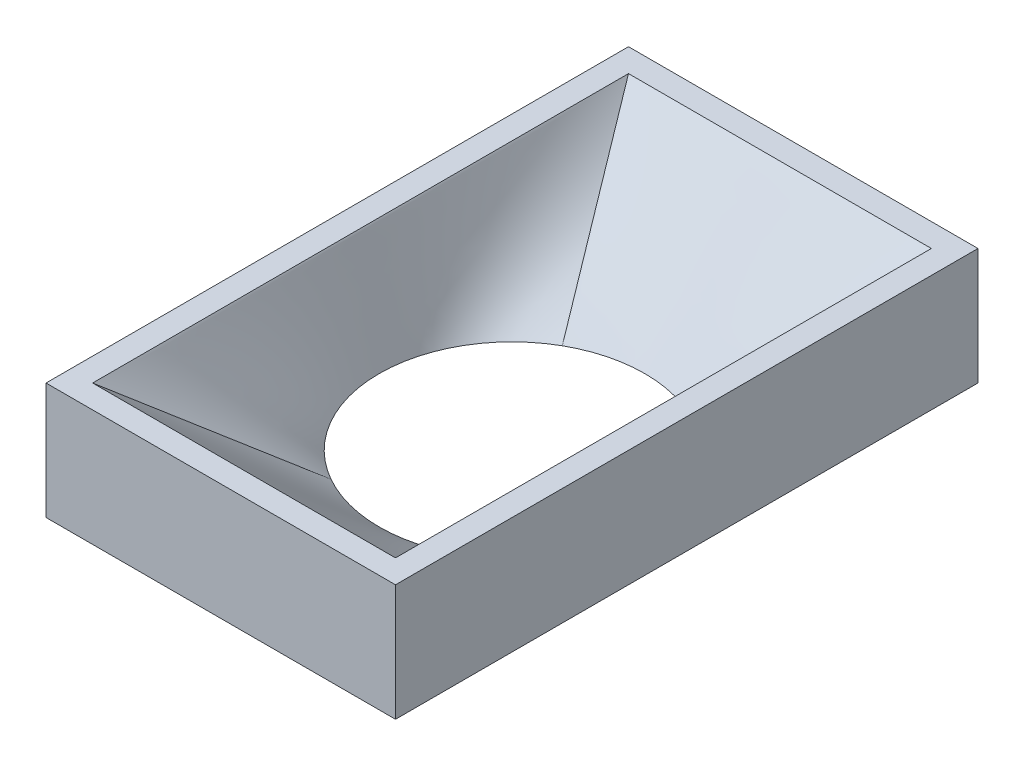
ISO-10303-21;
HEADER;
FILE_DESCRIPTION(('STEP AP214'),'2;1');
FILE_NAME('part.step','',(''),(''),'','','');
FILE_SCHEMA(('AUTOMOTIVE_DESIGN { 1 0 10303 214 1 1 1 1 }'));
ENDSEC;
DATA;
#1=APPLICATION_CONTEXT('core data for automotive mechanical design processes');
#2=APPLICATION_PROTOCOL_DEFINITION('international standard','automotive_design',2000,#1);
#3=PRODUCT_CONTEXT('',#1,'mechanical');
#4=PRODUCT('Part','Part','',(#3));
#5=PRODUCT_RELATED_PRODUCT_CATEGORY('part','',(#4));
#6=PRODUCT_DEFINITION_FORMATION('','',#4);
#7=PRODUCT_DEFINITION_CONTEXT('part definition',#1,'design');
#8=PRODUCT_DEFINITION('design','',#6,#7);
#9=PRODUCT_DEFINITION_SHAPE('','',#8);
#10=(LENGTH_UNIT() NAMED_UNIT(*) SI_UNIT(.MILLI.,.METRE.));
#11=(NAMED_UNIT(*) PLANE_ANGLE_UNIT() SI_UNIT($,.RADIAN.));
#12=(NAMED_UNIT(*) SI_UNIT($,.STERADIAN.) SOLID_ANGLE_UNIT());
#13=UNCERTAINTY_MEASURE_WITH_UNIT(LENGTH_MEASURE(1.E-05),#10,'distance_accuracy_value','');
#14=(GEOMETRIC_REPRESENTATION_CONTEXT(3) GLOBAL_UNCERTAINTY_ASSIGNED_CONTEXT((#13)) GLOBAL_UNIT_ASSIGNED_CONTEXT((#10,
#11,#12)) REPRESENTATION_CONTEXT('',''));
#15=CARTESIAN_POINT('',(0.,0.,0.));
#16=DIRECTION('',(0.,0.,1.));
#17=DIRECTION('',(1.,0.,0.));
#18=AXIS2_PLACEMENT_3D('',#15,#16,#17);
#19=CARTESIAN_POINT('',(19.05,12.7,-31.75));
#20=DIRECTION('',(-1.,0.,0.));
#21=DIRECTION('',(0.,0.,1.));
#22=AXIS2_PLACEMENT_3D('',#19,#20,#21);
#23=PLANE('',#22);
#24=DIRECTION('',(0.,0.,-1.));
#25=VECTOR('',#24,1.);
#26=CARTESIAN_POINT('',(19.05,0.,-31.75));
#27=LINE('',#26,#25);
#28=CARTESIAN_POINT('',(19.05,0.,31.75));
#29=VERTEX_POINT('',#28);
#30=CARTESIAN_POINT('',(19.05,0.,-31.75));
#31=VERTEX_POINT('',#30);
#32=EDGE_CURVE('E284',#29,#31,#27,.T.);
#33=ORIENTED_EDGE('',*,*,#32,.T.);
#34=DIRECTION('',(0.,-1.,0.));
#35=VECTOR('',#34,1.);
#36=CARTESIAN_POINT('',(19.05,12.7,-31.75));
#37=LINE('',#36,#35);
#38=CARTESIAN_POINT('',(19.05,12.7,-31.75));
#39=VERTEX_POINT('',#38);
#40=EDGE_CURVE('E12',#39,#31,#37,.T.);
#41=ORIENTED_EDGE('',*,*,#40,.F.);
#42=DIRECTION('',(0.,0.,-1.));
#43=VECTOR('',#42,1.);
#44=CARTESIAN_POINT('',(19.05,12.7,-31.75));
#45=LINE('',#44,#43);
#46=CARTESIAN_POINT('',(19.05,12.7,31.75));
#47=VERTEX_POINT('',#46);
#48=EDGE_CURVE('E269',#47,#39,#45,.T.);
#49=ORIENTED_EDGE('',*,*,#48,.F.);
#50=DIRECTION('',(0.,-1.,0.));
#51=VECTOR('',#50,1.);
#52=CARTESIAN_POINT('',(19.05,12.7,31.75));
#53=LINE('',#52,#51);
#54=EDGE_CURVE('E283',#47,#29,#53,.T.);
#55=ORIENTED_EDGE('',*,*,#54,.T.);
#56=EDGE_LOOP('',(#33,#41,#49,#55));
#57=FACE_BOUND('',#56,.T.);
#58=ADVANCED_FACE('F73',(#57),#23,.F.);
#59=CARTESIAN_POINT('',(-19.05,12.7,-31.75));
#60=DIRECTION('',(0.,0.,1.));
#61=DIRECTION('',(1.,0.,0.));
#62=AXIS2_PLACEMENT_3D('',#59,#60,#61);
#63=PLANE('',#62);
#64=DIRECTION('',(-1.,0.,0.));
#65=VECTOR('',#64,1.);
#66=CARTESIAN_POINT('',(-19.05,0.,-31.75));
#67=LINE('',#66,#65);
#68=CARTESIAN_POINT('',(-19.05,0.,-31.75));
#69=VERTEX_POINT('',#68);
#70=EDGE_CURVE('E288',#31,#69,#67,.T.);
#71=ORIENTED_EDGE('',*,*,#70,.T.);
#72=DIRECTION('',(0.,-1.,0.));
#73=VECTOR('',#72,1.);
#74=CARTESIAN_POINT('',(-19.05,12.7,-31.75));
#75=LINE('',#74,#73);
#76=CARTESIAN_POINT('',(-19.05,12.7,-31.75));
#77=VERTEX_POINT('',#76);
#78=EDGE_CURVE('E83',#77,#69,#75,.T.);
#79=ORIENTED_EDGE('',*,*,#78,.F.);
#80=DIRECTION('',(-1.,0.,0.));
#81=VECTOR('',#80,1.);
#82=CARTESIAN_POINT('',(-19.05,12.7,-31.75));
#83=LINE('',#82,#81);
#84=EDGE_CURVE('E273',#39,#77,#83,.T.);
#85=ORIENTED_EDGE('',*,*,#84,.F.);
#86=ORIENTED_EDGE('',*,*,#40,.T.);
#87=EDGE_LOOP('',(#71,#79,#85,#86));
#88=FACE_BOUND('',#87,.T.);
#89=ADVANCED_FACE('F321',(#88),#63,.F.);
#90=CARTESIAN_POINT('',(-19.05,12.7,-31.75));
#91=DIRECTION('',(1.,0.,0.));
#92=DIRECTION('',(0.,0.,-1.));
#93=AXIS2_PLACEMENT_3D('',#90,#91,#92);
#94=PLANE('',#93);
#95=DIRECTION('',(0.,0.,1.));
#96=VECTOR('',#95,1.);
#97=CARTESIAN_POINT('',(-19.05,0.,-31.75));
#98=LINE('',#97,#96);
#99=CARTESIAN_POINT('',(-19.05,0.,31.75));
#100=VERTEX_POINT('',#99);
#101=EDGE_CURVE('E291',#69,#100,#98,.T.);
#102=ORIENTED_EDGE('',*,*,#101,.T.);
#103=DIRECTION('',(0.,-1.,0.));
#104=VECTOR('',#103,1.);
#105=CARTESIAN_POINT('',(-19.05,12.7,31.75));
#106=LINE('',#105,#104);
#107=CARTESIAN_POINT('',(-19.05,12.7,31.75));
#108=VERTEX_POINT('',#107);
#109=EDGE_CURVE('E299',#108,#100,#106,.T.);
#110=ORIENTED_EDGE('',*,*,#109,.F.);
#111=DIRECTION('',(0.,0.,1.));
#112=VECTOR('',#111,1.);
#113=CARTESIAN_POINT('',(-19.05,12.7,-31.75));
#114=LINE('',#113,#112);
#115=EDGE_CURVE('E277',#77,#108,#114,.T.);
#116=ORIENTED_EDGE('',*,*,#115,.F.);
#117=ORIENTED_EDGE('',*,*,#78,.T.);
#118=EDGE_LOOP('',(#102,#110,#116,#117));
#119=FACE_BOUND('',#118,.T.);
#120=ADVANCED_FACE('F309',(#119),#94,.F.);
#121=CARTESIAN_POINT('',(-19.05,12.7,31.75));
#122=DIRECTION('',(0.,0.,-1.));
#123=DIRECTION('',(-1.,0.,0.));
#124=AXIS2_PLACEMENT_3D('',#121,#122,#123);
#125=PLANE('',#124);
#126=DIRECTION('',(1.,0.,0.));
#127=VECTOR('',#126,1.);
#128=CARTESIAN_POINT('',(-19.05,0.,31.75));
#129=LINE('',#128,#127);
#130=EDGE_CURVE('E274',#100,#29,#129,.T.);
#131=ORIENTED_EDGE('',*,*,#130,.T.);
#132=ORIENTED_EDGE('',*,*,#54,.F.);
#133=DIRECTION('',(1.,0.,0.));
#134=VECTOR('',#133,1.);
#135=CARTESIAN_POINT('',(-19.05,12.7,31.75));
#136=LINE('',#135,#134);
#137=EDGE_CURVE('E280',#108,#47,#136,.T.);
#138=ORIENTED_EDGE('',*,*,#137,.F.);
#139=ORIENTED_EDGE('',*,*,#109,.T.);
#140=EDGE_LOOP('',(#131,#132,#138,#139));
#141=FACE_BOUND('',#140,.T.);
#142=ADVANCED_FACE('F193',(#141),#125,.F.);
#143=CARTESIAN_POINT('',(0.,12.7,0.));
#144=DIRECTION('',(0.,1.,0.));
#145=DIRECTION('',(0.,0.,1.));
#146=AXIS2_PLACEMENT_3D('',#143,#144,#145);
#147=PLANE('',#146);
#148=DIRECTION('',(0.,0.,-1.));
#149=VECTOR('',#148,1.);
#150=CARTESIAN_POINT('',(16.51,12.7,29.21));
#151=LINE('',#150,#149);
#152=CARTESIAN_POINT('',(16.51,12.7,29.21));
#153=VERTEX_POINT('',#152);
#154=CARTESIAN_POINT('',(16.51,12.7,-29.21));
#155=VERTEX_POINT('',#154);
#156=EDGE_CURVE('E76',#153,#155,#151,.T.);
#157=ORIENTED_EDGE('',*,*,#156,.F.);
#158=DIRECTION('',(1.,0.,0.));
#159=VECTOR('',#158,1.);
#160=CARTESIAN_POINT('',(-16.51,12.7,29.21));
#161=LINE('',#160,#159);
#162=CARTESIAN_POINT('',(-16.51,12.7,29.21));
#163=VERTEX_POINT('',#162);
#164=EDGE_CURVE('E224',#163,#153,#161,.T.);
#165=ORIENTED_EDGE('',*,*,#164,.F.);
#166=DIRECTION('',(0.,0.,1.));
#167=VECTOR('',#166,1.);
#168=CARTESIAN_POINT('',(-16.51,12.7,-29.21));
#169=LINE('',#168,#167);
#170=CARTESIAN_POINT('',(-16.51,12.7,-29.21));
#171=VERTEX_POINT('',#170);
#172=EDGE_CURVE('E212',#171,#163,#169,.T.);
#173=ORIENTED_EDGE('',*,*,#172,.F.);
#174=DIRECTION('',(-1.,0.,0.));
#175=VECTOR('',#174,1.);
#176=CARTESIAN_POINT('',(16.51,12.7,-29.21));
#177=LINE('',#176,#175);
#178=EDGE_CURVE('E144',#155,#171,#177,.T.);
#179=ORIENTED_EDGE('',*,*,#178,.F.);
#180=EDGE_LOOP('',(#157,#165,#173,#179));
#181=FACE_BOUND('',#180,.T.);
#182=ORIENTED_EDGE('',*,*,#48,.T.);
#183=ORIENTED_EDGE('',*,*,#84,.T.);
#184=ORIENTED_EDGE('',*,*,#115,.T.);
#185=ORIENTED_EDGE('',*,*,#137,.T.);
#186=EDGE_LOOP('',(#182,#183,#184,#185));
#187=FACE_BOUND('',#186,.T.);
#188=ADVANCED_FACE('F190',(#181,#187),#147,.T.);
#189=CARTESIAN_POINT('',(0.,0.,0.));
#190=DIRECTION('',(0.,1.,0.));
#191=DIRECTION('',(0.,0.,1.));
#192=AXIS2_PLACEMENT_3D('',#189,#190,#191);
#193=PLANE('',#192);
#194=CARTESIAN_POINT('',(0.,0.,0.));
#195=DIRECTION('',(0.,-1.,0.));
#196=DIRECTION('',(0.,0.,-1.));
#197=AXIS2_PLACEMENT_3D('',#194,#195,#196);
#198=CIRCLE('',#197,14.478);
#199=CARTESIAN_POINT('',(7.12400496203789,0.,12.6040087789901));
#200=VERTEX_POINT('',#199);
#201=CARTESIAN_POINT('',(-7.12400496203788,0.,12.6040087789901));
#202=VERTEX_POINT('',#201);
#203=EDGE_CURVE('E158',#200,#202,#198,.T.);
#204=ORIENTED_EDGE('',*,*,#203,.F.);
#205=CARTESIAN_POINT('',(7.12400496203788,0.,-12.6040087789901));
#206=VERTEX_POINT('',#205);
#207=EDGE_CURVE('E166',#206,#200,#198,.T.);
#208=ORIENTED_EDGE('',*,*,#207,.F.);
#209=CARTESIAN_POINT('',(-7.12400496203789,0.,-12.6040087789901));
#210=VERTEX_POINT('',#209);
#211=EDGE_CURVE('E140',#210,#206,#198,.T.);
#212=ORIENTED_EDGE('',*,*,#211,.F.);
#213=EDGE_CURVE('E151',#202,#210,#198,.T.);
#214=ORIENTED_EDGE('',*,*,#213,.F.);
#215=EDGE_LOOP('',(#204,#208,#212,#214));
#216=FACE_BOUND('',#215,.T.);
#217=ORIENTED_EDGE('',*,*,#32,.F.);
#218=ORIENTED_EDGE('',*,*,#130,.F.);
#219=ORIENTED_EDGE('',*,*,#101,.F.);
#220=ORIENTED_EDGE('',*,*,#70,.F.);
#221=EDGE_LOOP('',(#217,#218,#219,#220));
#222=FACE_BOUND('',#221,.T.);
#223=ADVANCED_FACE('F164',(#216,#222),#193,.F.);
#224=CARTESIAN_POINT('',(7.12400496203789,0.,12.6040087789901));
#225=CARTESIAN_POINT('',(16.51,12.7,29.21));
#226=CARTESIAN_POINT('',(8.03838676719548,0.,12.0871842804228));
#227=CARTESIAN_POINT('',(16.51,12.7,26.7758333333333));
#228=CARTESIAN_POINT('',(8.95634185612382,0.,11.4364622338791));
#229=CARTESIAN_POINT('',(16.51,12.7,24.3416666666667));
#230=CARTESIAN_POINT('',(10.6922438918038,0.,9.83283521823099));
#231=CARTESIAN_POINT('',(16.51,12.7,19.4733333333333));
#232=CARTESIAN_POINT('',(11.5092515371836,0.,8.87879806344041));
#233=CARTESIAN_POINT('',(16.51,12.7,17.0391666666667));
#234=CARTESIAN_POINT('',(12.9045619371135,0.,6.69090481240889));
#235=CARTESIAN_POINT('',(16.51,12.7,12.1708333333334));
#236=CARTESIAN_POINT('',(13.4809458760483,0.,5.45683370481204));
#237=CARTESIAN_POINT('',(16.51,12.7,9.73666666666669));
#238=CARTESIAN_POINT('',(14.2685346845504,0.,2.81457878743855));
#239=CARTESIAN_POINT('',(16.51,12.7,4.86833333333336));
#240=CARTESIAN_POINT('',(14.478,0.,1.407900481328));
#241=CARTESIAN_POINT('',(16.51,12.7,2.43416666666669));
#242=CARTESIAN_POINT('',(14.478,0.,-1.40790048132801));
#243=CARTESIAN_POINT('',(16.51,12.7,-2.43416666666664));
#244=CARTESIAN_POINT('',(14.2685346845504,0.,-2.81457878743855));
#245=CARTESIAN_POINT('',(16.51,12.7,-4.86833333333331));
#246=CARTESIAN_POINT('',(13.4809458760483,0.,-5.45683370481204));
#247=CARTESIAN_POINT('',(16.51,12.7,-9.73666666666664));
#248=CARTESIAN_POINT('',(12.9045619371135,0.,-6.6909048124089));
#249=CARTESIAN_POINT('',(16.51,12.7,-12.1708333333333));
#250=CARTESIAN_POINT('',(11.5092515371836,0.,-8.87879806344042));
#251=CARTESIAN_POINT('',(16.51,12.7,-17.0391666666666));
#252=CARTESIAN_POINT('',(10.6922438918038,0.,-9.832835218231));
#253=CARTESIAN_POINT('',(16.51,12.7,-19.4733333333333));
#254=CARTESIAN_POINT('',(8.95634185612381,0.,-11.4364622338791));
#255=CARTESIAN_POINT('',(16.51,12.7,-24.3416666666667));
#256=CARTESIAN_POINT('',(8.03838676719548,0.,-12.0871842804228));
#257=CARTESIAN_POINT('',(16.51,12.7,-26.7758333333333));
#258=CARTESIAN_POINT('',(7.12400496203788,0.,-12.6040087789901));
#259=CARTESIAN_POINT('',(16.51,12.7,-29.21));
#260=B_SPLINE_SURFACE_WITH_KNOTS('',3,1,((#224,#225),(#226,#227),(#228,#229),(#230,#231),(#232,
#233),(#234,#235),(#236,#237),(#238,#239),(#240,#241),(#242,#243),(#244,#245),(#246,#247),(#248,
#249),(#250,#251),(#252,#253),(#254,#255),(#256,#257),(#258,#259)),.UNSPECIFIED.,.F.,.F.,.F.,(4,
2,2,2,2,2,2,2,4),(2,2),(0.,0.125,0.25,0.375,0.5,0.625,0.75,0.875,1.),(0.,1.),.UNSPECIFIED.);
#261=DIRECTION('',(-0.409581519176259,-0.554196467449643,-0.724644226234919));
#262=VECTOR('',#261,1.);
#263=CARTESIAN_POINT('',(11.8170024810189,6.35,20.907004389495));
#264=LINE('',#263,#262);
#265=EDGE_CURVE('E169',#153,#200,#264,.T.);
#266=DIRECTION('',(0.409581519176259,0.554196467449643,-0.724644226234919));
#267=VECTOR('',#266,1.);
#268=CARTESIAN_POINT('',(11.8170024810189,6.35,-20.9070043894951));
#269=LINE('',#268,#267);
#270=EDGE_CURVE('E148',#206,#155,#269,.T.);
#271=ORIENTED_EDGE('',*,*,#207,.T.);
#272=ORIENTED_EDGE('',*,*,#265,.F.);
#273=ORIENTED_EDGE('',*,*,#156,.T.);
#274=ORIENTED_EDGE('',*,*,#270,.F.);
#275=EDGE_LOOP('',(#271,#272,#273,#274));
#276=FACE_BOUND('',#275,.T.);
#277=ADVANCED_FACE('F189',(#276),#260,.F.);
#278=CARTESIAN_POINT('',(7.12400496203788,0.,-12.6040087789901));
#279=CARTESIAN_POINT('',(16.51,12.7,-29.21));
#280=CARTESIAN_POINT('',(6.09035596490321,0.,-13.1882451686749));
#281=CARTESIAN_POINT('',(13.7583333333333,12.7,-29.21));
#282=CARTESIAN_POINT('',(4.94918337489155,0.,-13.6629183486809));
#283=CARTESIAN_POINT('',(11.0066666666667,12.7,-29.21));
#284=CARTESIAN_POINT('',(2.53825381796034,0.,-14.3082850627402));
#285=CARTESIAN_POINT('',(5.50333333333332,12.7,-29.21));
#286=CARTESIAN_POINT('',(1.26949401085294,0.,-14.478));
#287=CARTESIAN_POINT('',(2.75166666666665,12.7,-29.21));
#288=CARTESIAN_POINT('',(-1.26949401085295,0.,-14.478));
#289=CARTESIAN_POINT('',(-2.75166666666668,12.7,-29.21));
#290=CARTESIAN_POINT('',(-2.53825381796034,0.,-14.3082850627402));
#291=CARTESIAN_POINT('',(-5.50333333333334,12.7,-29.21));
#292=CARTESIAN_POINT('',(-4.94918337489156,0.,-13.6629183486809));
#293=CARTESIAN_POINT('',(-11.0066666666667,12.7,-29.21));
#294=CARTESIAN_POINT('',(-6.09035596490321,0.,-13.1882451686749));
#295=CARTESIAN_POINT('',(-13.7583333333333,12.7,-29.21));
#296=CARTESIAN_POINT('',(-7.12400496203789,0.,-12.6040087789901));
#297=CARTESIAN_POINT('',(-16.51,12.7,-29.21));
#298=B_SPLINE_SURFACE_WITH_KNOTS('',3,1,((#278,#279),(#280,#281),(#282,#283),(#284,#285),(#286,
#287),(#288,#289),(#290,#291),(#292,#293),(#294,#295),(#296,#297)),.UNSPECIFIED.,.F.,.F.,.F.,(4,
2,2,2,4),(2,2),(0.,0.25,0.5,0.75,1.),(0.,1.),.UNSPECIFIED.);
#299=DIRECTION('',(-0.409581519176258,0.554196467449643,-0.724644226234919));
#300=VECTOR('',#299,1.);
#301=CARTESIAN_POINT('',(-11.8170024810189,6.35,-20.9070043894951));
#302=LINE('',#301,#300);
#303=EDGE_CURVE('E91',#210,#171,#302,.T.);
#304=ORIENTED_EDGE('',*,*,#211,.T.);
#305=ORIENTED_EDGE('',*,*,#270,.T.);
#306=ORIENTED_EDGE('',*,*,#178,.T.);
#307=ORIENTED_EDGE('',*,*,#303,.F.);
#308=EDGE_LOOP('',(#304,#305,#306,#307));
#309=FACE_BOUND('',#308,.T.);
#310=ADVANCED_FACE('F138',(#309),#298,.F.);
#311=CARTESIAN_POINT('',(-7.12400496203788,0.,12.6040087789901));
#312=CARTESIAN_POINT('',(-16.51,12.7,29.21));
#313=CARTESIAN_POINT('',(-6.09035596490321,0.,13.1882451686749));
#314=CARTESIAN_POINT('',(-13.7583333333333,12.7,29.21));
#315=CARTESIAN_POINT('',(-4.94918337489155,0.,13.6629183486809));
#316=CARTESIAN_POINT('',(-11.0066666666667,12.7,29.21));
#317=CARTESIAN_POINT('',(-2.53825381796034,0.,14.3082850627402));
#318=CARTESIAN_POINT('',(-5.50333333333334,12.7,29.21));
#319=CARTESIAN_POINT('',(-1.26949401085294,0.,14.478));
#320=CARTESIAN_POINT('',(-2.75166666666667,12.7,29.21));
#321=CARTESIAN_POINT('',(1.26949401085295,0.,14.478));
#322=CARTESIAN_POINT('',(2.75166666666666,12.7,29.21));
#323=CARTESIAN_POINT('',(2.53825381796035,0.,14.3082850627402));
#324=CARTESIAN_POINT('',(5.50333333333332,12.7,29.21));
#325=CARTESIAN_POINT('',(4.94918337489156,0.,13.6629183486809));
#326=CARTESIAN_POINT('',(11.0066666666667,12.7,29.21));
#327=CARTESIAN_POINT('',(6.09035596490322,0.,13.1882451686749));
#328=CARTESIAN_POINT('',(13.7583333333333,12.7,29.21));
#329=CARTESIAN_POINT('',(7.12400496203789,0.,12.6040087789901));
#330=CARTESIAN_POINT('',(16.51,12.7,29.21));
#331=B_SPLINE_SURFACE_WITH_KNOTS('',3,1,((#311,#312),(#313,#314),(#315,#316),(#317,#318),(#319,
#320),(#321,#322),(#323,#324),(#325,#326),(#327,#328),(#329,#330)),.UNSPECIFIED.,.F.,.F.,.F.,(4,
2,2,2,4),(2,2),(0.,0.25,0.5,0.75,1.),(0.,1.),.UNSPECIFIED.);
#332=DIRECTION('',(-0.409581519176259,0.554196467449643,0.724644226234919));
#333=VECTOR('',#332,1.);
#334=CARTESIAN_POINT('',(-11.8170024810189,6.35,20.907004389495));
#335=LINE('',#334,#333);
#336=EDGE_CURVE('E96',#202,#163,#335,.T.);
#337=ORIENTED_EDGE('',*,*,#203,.T.);
#338=ORIENTED_EDGE('',*,*,#336,.T.);
#339=ORIENTED_EDGE('',*,*,#164,.T.);
#340=ORIENTED_EDGE('',*,*,#265,.T.);
#341=EDGE_LOOP('',(#337,#338,#339,#340));
#342=FACE_BOUND('',#341,.T.);
#343=ADVANCED_FACE('F378',(#342),#331,.F.);
#344=CARTESIAN_POINT('',(-7.12400496203789,0.,-12.6040087789901));
#345=CARTESIAN_POINT('',(-16.51,12.7,-29.21));
#346=CARTESIAN_POINT('',(-8.03838676719548,0.,-12.0871842804228));
#347=CARTESIAN_POINT('',(-16.51,12.7,-26.7758333333333));
#348=CARTESIAN_POINT('',(-8.95634185612382,0.,-11.4364622338791));
#349=CARTESIAN_POINT('',(-16.51,12.7,-24.3416666666667));
#350=CARTESIAN_POINT('',(-10.6922438918038,0.,-9.83283521823099));
#351=CARTESIAN_POINT('',(-16.51,12.7,-19.4733333333334));
#352=CARTESIAN_POINT('',(-11.5092515371836,0.,-8.87879806344042));
#353=CARTESIAN_POINT('',(-16.51,12.7,-17.0391666666667));
#354=CARTESIAN_POINT('',(-12.9045619371135,0.,-6.69090481240889));
#355=CARTESIAN_POINT('',(-16.51,12.7,-12.1708333333334));
#356=CARTESIAN_POINT('',(-13.4809458760483,0.,-5.45683370481204));
#357=CARTESIAN_POINT('',(-16.51,12.7,-9.7366666666667));
#358=CARTESIAN_POINT('',(-14.2685346845504,0.,-2.81457878743855));
#359=CARTESIAN_POINT('',(-16.51,12.7,-4.86833333333337));
#360=CARTESIAN_POINT('',(-14.478,0.,-1.407900481328));
#361=CARTESIAN_POINT('',(-16.51,12.7,-2.4341666666667));
#362=CARTESIAN_POINT('',(-14.478,0.,1.40790048132801));
#363=CARTESIAN_POINT('',(-16.51,12.7,2.43416666666663));
#364=CARTESIAN_POINT('',(-14.2685346845504,0.,2.81457878743855));
#365=CARTESIAN_POINT('',(-16.51,12.7,4.8683333333333));
#366=CARTESIAN_POINT('',(-13.4809458760483,0.,5.45683370481204));
#367=CARTESIAN_POINT('',(-16.51,12.7,9.73666666666663));
#368=CARTESIAN_POINT('',(-12.9045619371135,0.,6.6909048124089));
#369=CARTESIAN_POINT('',(-16.51,12.7,12.1708333333333));
#370=CARTESIAN_POINT('',(-11.5092515371836,0.,8.87879806344042));
#371=CARTESIAN_POINT('',(-16.51,12.7,17.0391666666666));
#372=CARTESIAN_POINT('',(-10.6922438918038,0.,9.832835218231));
#373=CARTESIAN_POINT('',(-16.51,12.7,19.4733333333333));
#374=CARTESIAN_POINT('',(-8.95634185612381,0.,11.4364622338791));
#375=CARTESIAN_POINT('',(-16.51,12.7,24.3416666666666));
#376=CARTESIAN_POINT('',(-8.03838676719548,0.,12.0871842804228));
#377=CARTESIAN_POINT('',(-16.51,12.7,26.7758333333333));
#378=CARTESIAN_POINT('',(-7.12400496203788,0.,12.6040087789901));
#379=CARTESIAN_POINT('',(-16.51,12.7,29.21));
#380=B_SPLINE_SURFACE_WITH_KNOTS('',3,1,((#344,#345),(#346,#347),(#348,#349),(#350,#351),(#352,
#353),(#354,#355),(#356,#357),(#358,#359),(#360,#361),(#362,#363),(#364,#365),(#366,#367),(#368,
#369),(#370,#371),(#372,#373),(#374,#375),(#376,#377),(#378,#379)),.UNSPECIFIED.,.F.,.F.,.F.,(4,
2,2,2,2,2,2,2,4),(2,2),(0.,0.125,0.25,0.375,0.5,0.625,0.75,0.875,1.),(0.,1.),.UNSPECIFIED.);
#381=ORIENTED_EDGE('',*,*,#213,.T.);
#382=ORIENTED_EDGE('',*,*,#303,.T.);
#383=ORIENTED_EDGE('',*,*,#172,.T.);
#384=ORIENTED_EDGE('',*,*,#336,.F.);
#385=EDGE_LOOP('',(#381,#382,#383,#384));
#386=FACE_BOUND('',#385,.T.);
#387=ADVANCED_FACE('F153',(#386),#380,.F.);
#388=CLOSED_SHELL('',(#58,#89,#120,#142,#188,#223,#277,#310,#343,#387));
#389=MANIFOLD_SOLID_BREP('B2',#388);
#390=ADVANCED_BREP_SHAPE_REPRESENTATION('',(#18,#389),#14);
#391=SHAPE_DEFINITION_REPRESENTATION(#9,#390);
ENDSEC;
END-ISO-10303-21;
